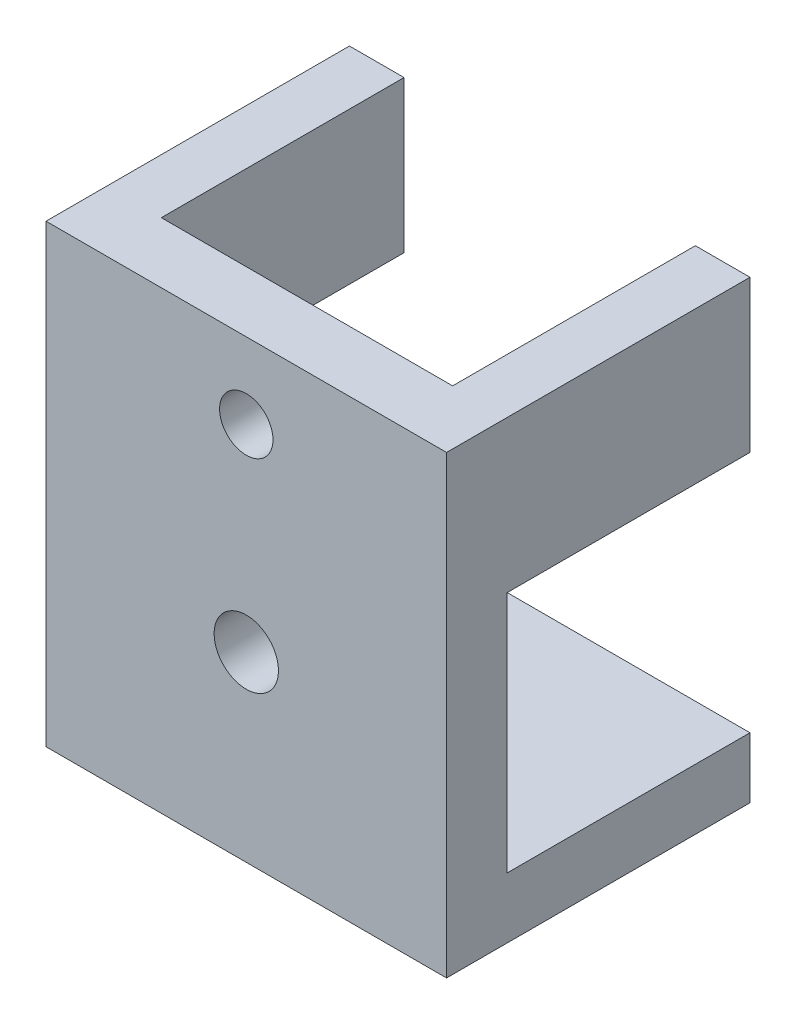
ISO-10303-21;
HEADER;
FILE_DESCRIPTION(('STEP AP214'),'2;1');
FILE_NAME('part.step','',(''),(''),'','','');
FILE_SCHEMA(('AUTOMOTIVE_DESIGN { 1 0 10303 214 1 1 1 1 }'));
ENDSEC;
DATA;
#1=APPLICATION_CONTEXT('core data for automotive mechanical design processes');
#2=APPLICATION_PROTOCOL_DEFINITION('international standard','automotive_design',2000,#1);
#3=PRODUCT_CONTEXT('',#1,'mechanical');
#4=PRODUCT('Part','Part','',(#3));
#5=PRODUCT_RELATED_PRODUCT_CATEGORY('part','',(#4));
#6=PRODUCT_DEFINITION_FORMATION('','',#4);
#7=PRODUCT_DEFINITION_CONTEXT('part definition',#1,'design');
#8=PRODUCT_DEFINITION('design','',#6,#7);
#9=PRODUCT_DEFINITION_SHAPE('','',#8);
#10=(LENGTH_UNIT() NAMED_UNIT(*) SI_UNIT(.MILLI.,.METRE.));
#11=(NAMED_UNIT(*) PLANE_ANGLE_UNIT() SI_UNIT($,.RADIAN.));
#12=(NAMED_UNIT(*) SI_UNIT($,.STERADIAN.) SOLID_ANGLE_UNIT());
#13=UNCERTAINTY_MEASURE_WITH_UNIT(LENGTH_MEASURE(1.E-05),#10,'distance_accuracy_value','');
#14=(GEOMETRIC_REPRESENTATION_CONTEXT(3) GLOBAL_UNCERTAINTY_ASSIGNED_CONTEXT((#13)) GLOBAL_UNIT_ASSIGNED_CONTEXT((#10,
#11,#12)) REPRESENTATION_CONTEXT('',''));
#15=CARTESIAN_POINT('',(0.,0.,0.));
#16=DIRECTION('',(0.,0.,1.));
#17=DIRECTION('',(1.,0.,0.));
#18=AXIS2_PLACEMENT_3D('',#15,#16,#17);
#19=CARTESIAN_POINT('',(0.,0.,0.));
#20=DIRECTION('',(0.,0.,-1.));
#21=DIRECTION('',(-1.,0.,0.));
#22=AXIS2_PLACEMENT_3D('',#19,#20,#21);
#23=PLANE('',#22);
#24=CARTESIAN_POINT('',(16.5,31.25,0.));
#25=DIRECTION('',(0.,0.,-1.));
#26=DIRECTION('',(-1.,0.,0.));
#27=AXIS2_PLACEMENT_3D('',#24,#25,#26);
#28=CIRCLE('',#27,2.2);
#29=CARTESIAN_POINT('',(14.3,31.25,0.));
#30=VERTEX_POINT('',#29);
#31=EDGE_CURVE('E166',#30,#30,#28,.T.);
#32=ORIENTED_EDGE('',*,*,#31,.F.);
#33=EDGE_LOOP('',(#32));
#34=FACE_BOUND('',#33,.T.);
#35=CARTESIAN_POINT('',(16.5,15.,0.));
#36=DIRECTION('',(0.,0.,-1.));
#37=DIRECTION('',(-1.,0.,0.));
#38=AXIS2_PLACEMENT_3D('',#35,#36,#37);
#39=CIRCLE('',#38,2.65);
#40=CARTESIAN_POINT('',(13.85,15.,0.));
#41=VERTEX_POINT('',#40);
#42=EDGE_CURVE('E213',#41,#41,#39,.T.);
#43=ORIENTED_EDGE('',*,*,#42,.F.);
#44=EDGE_LOOP('',(#43));
#45=FACE_BOUND('',#44,.T.);
#46=DIRECTION('',(-1.,0.,0.));
#47=VECTOR('',#46,1.);
#48=CARTESIAN_POINT('',(0.,25.,0.));
#49=LINE('',#48,#47);
#50=CARTESIAN_POINT('',(4.49999999999999,25.,0.));
#51=VERTEX_POINT('',#50);
#52=CARTESIAN_POINT('',(0.,25.,0.));
#53=VERTEX_POINT('',#52);
#54=EDGE_CURVE('E160',#51,#53,#49,.T.);
#55=ORIENTED_EDGE('',*,*,#54,.F.);
#56=DIRECTION('',(0.,-1.,0.));
#57=VECTOR('',#56,1.);
#58=CARTESIAN_POINT('',(4.49999999999999,37.5,0.));
#59=LINE('',#58,#57);
#60=CARTESIAN_POINT('',(4.49999999999999,37.5,0.));
#61=VERTEX_POINT('',#60);
#62=EDGE_CURVE('E163',#61,#51,#59,.T.);
#63=ORIENTED_EDGE('',*,*,#62,.F.);
#64=DIRECTION('',(-1.,0.,0.));
#65=VECTOR('',#64,1.);
#66=CARTESIAN_POINT('',(0.,37.5,0.));
#67=LINE('',#66,#65);
#68=CARTESIAN_POINT('',(28.5,37.5,0.));
#69=VERTEX_POINT('',#68);
#70=EDGE_CURVE('E251',#69,#61,#67,.T.);
#71=ORIENTED_EDGE('',*,*,#70,.F.);
#72=DIRECTION('',(0.,1.,0.));
#73=VECTOR('',#72,1.);
#74=CARTESIAN_POINT('',(28.5,37.5,0.));
#75=LINE('',#74,#73);
#76=CARTESIAN_POINT('',(28.5,25.,0.));
#77=VERTEX_POINT('',#76);
#78=EDGE_CURVE('E190',#77,#69,#75,.T.);
#79=ORIENTED_EDGE('',*,*,#78,.F.);
#80=DIRECTION('',(-1.,0.,0.));
#81=VECTOR('',#80,1.);
#82=CARTESIAN_POINT('',(33.,25.,0.));
#83=LINE('',#82,#81);
#84=CARTESIAN_POINT('',(33.,25.,0.));
#85=VERTEX_POINT('',#84);
#86=EDGE_CURVE('E184',#85,#77,#83,.T.);
#87=ORIENTED_EDGE('',*,*,#86,.F.);
#88=DIRECTION('',(0.,1.,0.));
#89=VECTOR('',#88,1.);
#90=CARTESIAN_POINT('',(33.,0.,0.));
#91=LINE('',#90,#89);
#92=CARTESIAN_POINT('',(33.,5.,0.));
#93=VERTEX_POINT('',#92);
#94=EDGE_CURVE('E261',#93,#85,#91,.T.);
#95=ORIENTED_EDGE('',*,*,#94,.F.);
#96=DIRECTION('',(-1.,0.,0.));
#97=VECTOR('',#96,1.);
#98=CARTESIAN_POINT('',(0.,5.,0.));
#99=LINE('',#98,#97);
#100=CARTESIAN_POINT('',(0.,5.,0.));
#101=VERTEX_POINT('',#100);
#102=EDGE_CURVE('E227',#93,#101,#99,.T.);
#103=ORIENTED_EDGE('',*,*,#102,.T.);
#104=DIRECTION('',(0.,-1.,0.));
#105=VECTOR('',#104,1.);
#106=CARTESIAN_POINT('',(0.,0.,0.));
#107=LINE('',#106,#105);
#108=EDGE_CURVE('E66',#53,#101,#107,.T.);
#109=ORIENTED_EDGE('',*,*,#108,.F.);
#110=EDGE_LOOP('',(#55,#63,#71,#79,#87,#95,#103,#109));
#111=FACE_BOUND('',#110,.T.);
#112=ADVANCED_FACE('F40',(#34,#45,#111),#23,.T.);
#113=CARTESIAN_POINT('',(0.,0.,5.));
#114=DIRECTION('',(1.,0.,0.));
#115=DIRECTION('',(0.,1.,0.));
#116=AXIS2_PLACEMENT_3D('',#113,#114,#115);
#117=PLANE('',#116);
#118=DIRECTION('',(0.,0.,-1.));
#119=VECTOR('',#118,1.);
#120=CARTESIAN_POINT('',(0.,37.5,5.));
#121=LINE('',#120,#119);
#122=CARTESIAN_POINT('',(0.,37.5,5.));
#123=VERTEX_POINT('',#122);
#124=CARTESIAN_POINT('',(0.,37.5,-20.));
#125=VERTEX_POINT('',#124);
#126=EDGE_CURVE('E134',#123,#125,#121,.T.);
#127=ORIENTED_EDGE('',*,*,#126,.T.);
#128=DIRECTION('',(0.,1.,0.));
#129=VECTOR('',#128,1.);
#130=CARTESIAN_POINT('',(0.,37.5,-20.));
#131=LINE('',#130,#129);
#132=CARTESIAN_POINT('',(0.,25.,-20.));
#133=VERTEX_POINT('',#132);
#134=EDGE_CURVE('E137',#133,#125,#131,.T.);
#135=ORIENTED_EDGE('',*,*,#134,.F.);
#136=DIRECTION('',(0.,0.,1.));
#137=VECTOR('',#136,1.);
#138=CARTESIAN_POINT('',(0.,25.,-20.));
#139=LINE('',#138,#137);
#140=EDGE_CURVE('E173',#133,#53,#139,.T.);
#141=ORIENTED_EDGE('',*,*,#140,.T.);
#142=ORIENTED_EDGE('',*,*,#108,.T.);
#143=DIRECTION('',(0.,0.,1.));
#144=VECTOR('',#143,1.);
#145=CARTESIAN_POINT('',(0.,5.,-20.));
#146=LINE('',#145,#144);
#147=CARTESIAN_POINT('',(0.,5.,-20.));
#148=VERTEX_POINT('',#147);
#149=EDGE_CURVE('E243',#148,#101,#146,.T.);
#150=ORIENTED_EDGE('',*,*,#149,.F.);
#151=DIRECTION('',(0.,-1.,0.));
#152=VECTOR('',#151,1.);
#153=CARTESIAN_POINT('',(0.,0.,-20.));
#154=LINE('',#153,#152);
#155=CARTESIAN_POINT('',(0.,0.,-20.));
#156=VERTEX_POINT('',#155);
#157=EDGE_CURVE('E222',#148,#156,#154,.T.);
#158=ORIENTED_EDGE('',*,*,#157,.T.);
#159=DIRECTION('',(0.,0.,-1.));
#160=VECTOR('',#159,1.);
#161=CARTESIAN_POINT('',(0.,0.,5.));
#162=LINE('',#161,#160);
#163=CARTESIAN_POINT('',(0.,0.,5.));
#164=VERTEX_POINT('',#163);
#165=EDGE_CURVE('E12',#164,#156,#162,.T.);
#166=ORIENTED_EDGE('',*,*,#165,.F.);
#167=DIRECTION('',(0.,-1.,0.));
#168=VECTOR('',#167,1.);
#169=CARTESIAN_POINT('',(0.,0.,5.));
#170=LINE('',#169,#168);
#171=EDGE_CURVE('E140',#123,#164,#170,.T.);
#172=ORIENTED_EDGE('',*,*,#171,.F.);
#173=EDGE_LOOP('',(#127,#135,#141,#142,#150,#158,#166,#172));
#174=FACE_BOUND('',#173,.T.);
#175=ADVANCED_FACE('F42',(#174),#117,.F.);
#176=CARTESIAN_POINT('',(0.,0.,5.));
#177=DIRECTION('',(0.,1.,0.));
#178=DIRECTION('',(0.,0.,1.));
#179=AXIS2_PLACEMENT_3D('',#176,#177,#178);
#180=PLANE('',#179);
#181=CARTESIAN_POINT('',(16.5,0.,-10.));
#182=DIRECTION('',(0.,-1.,0.));
#183=DIRECTION('',(0.,0.,-1.));
#184=AXIS2_PLACEMENT_3D('',#181,#182,#183);
#185=CIRCLE('',#184,2.65);
#186=CARTESIAN_POINT('',(16.5,0.,-12.65));
#187=VERTEX_POINT('',#186);
#188=EDGE_CURVE('E217',#187,#187,#185,.T.);
#189=ORIENTED_EDGE('',*,*,#188,.F.);
#190=EDGE_LOOP('',(#189));
#191=FACE_BOUND('',#190,.T.);
#192=ORIENTED_EDGE('',*,*,#165,.T.);
#193=DIRECTION('',(1.,0.,0.));
#194=VECTOR('',#193,1.);
#195=CARTESIAN_POINT('',(0.,0.,-20.));
#196=LINE('',#195,#194);
#197=CARTESIAN_POINT('',(33.,0.,-20.));
#198=VERTEX_POINT('',#197);
#199=EDGE_CURVE('E226',#156,#198,#196,.T.);
#200=ORIENTED_EDGE('',*,*,#199,.T.);
#201=DIRECTION('',(0.,0.,-1.));
#202=VECTOR('',#201,1.);
#203=CARTESIAN_POINT('',(33.,0.,5.));
#204=LINE('',#203,#202);
#205=CARTESIAN_POINT('',(33.,0.,5.));
#206=VERTEX_POINT('',#205);
#207=EDGE_CURVE('E50',#206,#198,#204,.T.);
#208=ORIENTED_EDGE('',*,*,#207,.F.);
#209=DIRECTION('',(1.,0.,0.));
#210=VECTOR('',#209,1.);
#211=CARTESIAN_POINT('',(0.,0.,5.));
#212=LINE('',#211,#210);
#213=EDGE_CURVE('E250',#164,#206,#212,.T.);
#214=ORIENTED_EDGE('',*,*,#213,.F.);
#215=EDGE_LOOP('',(#192,#200,#208,#214));
#216=FACE_BOUND('',#215,.T.);
#217=ADVANCED_FACE('F301',(#191,#216),#180,.F.);
#218=CARTESIAN_POINT('',(33.,0.,5.));
#219=DIRECTION('',(-1.,0.,0.));
#220=DIRECTION('',(0.,-1.,0.));
#221=AXIS2_PLACEMENT_3D('',#218,#219,#220);
#222=PLANE('',#221);
#223=ORIENTED_EDGE('',*,*,#207,.T.);
#224=DIRECTION('',(0.,1.,0.));
#225=VECTOR('',#224,1.);
#226=CARTESIAN_POINT('',(33.,0.,-20.));
#227=LINE('',#226,#225);
#228=CARTESIAN_POINT('',(33.,5.,-20.));
#229=VERTEX_POINT('',#228);
#230=EDGE_CURVE('E231',#198,#229,#227,.T.);
#231=ORIENTED_EDGE('',*,*,#230,.T.);
#232=DIRECTION('',(0.,0.,1.));
#233=VECTOR('',#232,1.);
#234=CARTESIAN_POINT('',(33.,5.,-20.));
#235=LINE('',#234,#233);
#236=EDGE_CURVE('E239',#229,#93,#235,.T.);
#237=ORIENTED_EDGE('',*,*,#236,.T.);
#238=ORIENTED_EDGE('',*,*,#94,.T.);
#239=DIRECTION('',(0.,0.,1.));
#240=VECTOR('',#239,1.);
#241=CARTESIAN_POINT('',(33.,25.,-20.));
#242=LINE('',#241,#240);
#243=CARTESIAN_POINT('',(33.,25.,-20.));
#244=VERTEX_POINT('',#243);
#245=EDGE_CURVE('E210',#244,#85,#242,.T.);
#246=ORIENTED_EDGE('',*,*,#245,.F.);
#247=DIRECTION('',(0.,-1.,0.));
#248=VECTOR('',#247,1.);
#249=CARTESIAN_POINT('',(33.,37.5,-20.));
#250=LINE('',#249,#248);
#251=CARTESIAN_POINT('',(33.,37.5,-20.));
#252=VERTEX_POINT('',#251);
#253=EDGE_CURVE('E185',#252,#244,#250,.T.);
#254=ORIENTED_EDGE('',*,*,#253,.F.);
#255=DIRECTION('',(0.,0.,-1.));
#256=VECTOR('',#255,1.);
#257=CARTESIAN_POINT('',(33.,37.5,5.));
#258=LINE('',#257,#256);
#259=CARTESIAN_POINT('',(33.,37.5,5.));
#260=VERTEX_POINT('',#259);
#261=EDGE_CURVE('E143',#260,#252,#258,.T.);
#262=ORIENTED_EDGE('',*,*,#261,.F.);
#263=DIRECTION('',(0.,1.,0.));
#264=VECTOR('',#263,1.);
#265=CARTESIAN_POINT('',(33.,0.,5.));
#266=LINE('',#265,#264);
#267=EDGE_CURVE('E254',#206,#260,#266,.T.);
#268=ORIENTED_EDGE('',*,*,#267,.F.);
#269=EDGE_LOOP('',(#223,#231,#237,#238,#246,#254,#262,#268));
#270=FACE_BOUND('',#269,.T.);
#271=ADVANCED_FACE('F291',(#270),#222,.F.);
#272=CARTESIAN_POINT('',(0.,37.5,5.));
#273=DIRECTION('',(0.,-1.,0.));
#274=DIRECTION('',(0.,0.,-1.));
#275=AXIS2_PLACEMENT_3D('',#272,#273,#274);
#276=PLANE('',#275);
#277=ORIENTED_EDGE('',*,*,#261,.T.);
#278=DIRECTION('',(1.,0.,0.));
#279=VECTOR('',#278,1.);
#280=CARTESIAN_POINT('',(33.,37.5,-20.));
#281=LINE('',#280,#279);
#282=CARTESIAN_POINT('',(28.5,37.5,-20.));
#283=VERTEX_POINT('',#282);
#284=EDGE_CURVE('E196',#283,#252,#281,.T.);
#285=ORIENTED_EDGE('',*,*,#284,.F.);
#286=DIRECTION('',(0.,0.,1.));
#287=VECTOR('',#286,1.);
#288=CARTESIAN_POINT('',(28.5,37.5,-20.));
#289=LINE('',#288,#287);
#290=EDGE_CURVE('E58',#283,#69,#289,.T.);
#291=ORIENTED_EDGE('',*,*,#290,.T.);
#292=ORIENTED_EDGE('',*,*,#70,.T.);
#293=DIRECTION('',(0.,0.,1.));
#294=VECTOR('',#293,1.);
#295=CARTESIAN_POINT('',(4.49999999999999,37.5,-20.));
#296=LINE('',#295,#294);
#297=CARTESIAN_POINT('',(4.49999999999999,37.5,-20.));
#298=VERTEX_POINT('',#297);
#299=EDGE_CURVE('E149',#298,#61,#296,.T.);
#300=ORIENTED_EDGE('',*,*,#299,.F.);
#301=DIRECTION('',(1.,0.,0.));
#302=VECTOR('',#301,1.);
#303=CARTESIAN_POINT('',(0.,37.5,-20.));
#304=LINE('',#303,#302);
#305=EDGE_CURVE('E147',#125,#298,#304,.T.);
#306=ORIENTED_EDGE('',*,*,#305,.F.);
#307=ORIENTED_EDGE('',*,*,#126,.F.);
#308=DIRECTION('',(-1.,0.,0.));
#309=VECTOR('',#308,1.);
#310=CARTESIAN_POINT('',(0.,37.5,5.));
#311=LINE('',#310,#309);
#312=EDGE_CURVE('E144',#260,#123,#311,.T.);
#313=ORIENTED_EDGE('',*,*,#312,.F.);
#314=EDGE_LOOP('',(#277,#285,#291,#292,#300,#306,#307,#313));
#315=FACE_BOUND('',#314,.T.);
#316=ADVANCED_FACE('F148',(#315),#276,.F.);
#317=CARTESIAN_POINT('',(0.,0.,5.));
#318=DIRECTION('',(0.,0.,-1.));
#319=DIRECTION('',(-1.,0.,0.));
#320=AXIS2_PLACEMENT_3D('',#317,#318,#319);
#321=PLANE('',#320);
#322=CARTESIAN_POINT('',(16.5,31.25,5.));
#323=DIRECTION('',(0.,0.,1.));
#324=DIRECTION('',(1.,0.,0.));
#325=AXIS2_PLACEMENT_3D('',#322,#323,#324);
#326=CIRCLE('',#325,2.2);
#327=CARTESIAN_POINT('',(18.7,31.25,5.));
#328=VERTEX_POINT('',#327);
#329=EDGE_CURVE('E413',#328,#328,#326,.T.);
#330=ORIENTED_EDGE('',*,*,#329,.F.);
#331=EDGE_LOOP('',(#330));
#332=FACE_BOUND('',#331,.T.);
#333=CARTESIAN_POINT('',(16.5,15.,5.));
#334=DIRECTION('',(0.,0.,-1.));
#335=DIRECTION('',(-1.,0.,0.));
#336=AXIS2_PLACEMENT_3D('',#333,#334,#335);
#337=CIRCLE('',#336,2.65);
#338=CARTESIAN_POINT('',(13.85,15.,5.));
#339=VERTEX_POINT('',#338);
#340=EDGE_CURVE('E44',#339,#339,#337,.T.);
#341=ORIENTED_EDGE('',*,*,#340,.T.);
#342=EDGE_LOOP('',(#341));
#343=FACE_BOUND('',#342,.T.);
#344=ORIENTED_EDGE('',*,*,#171,.T.);
#345=ORIENTED_EDGE('',*,*,#213,.T.);
#346=ORIENTED_EDGE('',*,*,#267,.T.);
#347=ORIENTED_EDGE('',*,*,#312,.T.);
#348=EDGE_LOOP('',(#344,#345,#346,#347));
#349=FACE_BOUND('',#348,.T.);
#350=ADVANCED_FACE('F281',(#332,#343,#349),#321,.F.);
#351=CARTESIAN_POINT('',(0.,5.,-20.));
#352=DIRECTION('',(0.,1.,0.));
#353=DIRECTION('',(0.,0.,1.));
#354=AXIS2_PLACEMENT_3D('',#351,#352,#353);
#355=PLANE('',#354);
#356=CARTESIAN_POINT('',(16.5,5.,-10.));
#357=DIRECTION('',(0.,1.,0.));
#358=DIRECTION('',(0.,0.,1.));
#359=AXIS2_PLACEMENT_3D('',#356,#357,#358);
#360=CIRCLE('',#359,2.65);
#361=CARTESIAN_POINT('',(16.5,5.,-7.34999999999999));
#362=VERTEX_POINT('',#361);
#363=EDGE_CURVE('E221',#362,#362,#360,.T.);
#364=ORIENTED_EDGE('',*,*,#363,.F.);
#365=EDGE_LOOP('',(#364));
#366=FACE_BOUND('',#365,.T.);
#367=ORIENTED_EDGE('',*,*,#102,.F.);
#368=ORIENTED_EDGE('',*,*,#236,.F.);
#369=DIRECTION('',(-1.,0.,0.));
#370=VECTOR('',#369,1.);
#371=CARTESIAN_POINT('',(0.,5.,-20.));
#372=LINE('',#371,#370);
#373=EDGE_CURVE('E235',#229,#148,#372,.T.);
#374=ORIENTED_EDGE('',*,*,#373,.T.);
#375=ORIENTED_EDGE('',*,*,#149,.T.);
#376=EDGE_LOOP('',(#367,#368,#374,#375));
#377=FACE_BOUND('',#376,.T.);
#378=ADVANCED_FACE('F277',(#366,#377),#355,.T.);
#379=CARTESIAN_POINT('',(0.,0.,-20.));
#380=DIRECTION('',(0.,0.,-1.));
#381=DIRECTION('',(-1.,0.,0.));
#382=AXIS2_PLACEMENT_3D('',#379,#380,#381);
#383=PLANE('',#382);
#384=ORIENTED_EDGE('',*,*,#157,.F.);
#385=ORIENTED_EDGE('',*,*,#373,.F.);
#386=ORIENTED_EDGE('',*,*,#230,.F.);
#387=ORIENTED_EDGE('',*,*,#199,.F.);
#388=EDGE_LOOP('',(#384,#385,#386,#387));
#389=FACE_BOUND('',#388,.T.);
#390=ADVANCED_FACE('F280',(#389),#383,.T.);
#391=CARTESIAN_POINT('',(16.5,10.,-10.));
#392=DIRECTION('',(0.,-1.,0.));
#393=DIRECTION('',(0.,0.,-1.));
#394=AXIS2_PLACEMENT_3D('',#391,#392,#393);
#395=CYLINDRICAL_SURFACE('',#394,2.65);
#396=ORIENTED_EDGE('',*,*,#363,.T.);
#397=EDGE_LOOP('',(#396));
#398=FACE_BOUND('',#397,.T.);
#399=ORIENTED_EDGE('',*,*,#188,.T.);
#400=EDGE_LOOP('',(#399));
#401=FACE_BOUND('',#400,.T.);
#402=ADVANCED_FACE('F274',(#398,#401),#395,.F.);
#403=CARTESIAN_POINT('',(16.5,15.,10.));
#404=DIRECTION('',(0.,0.,-1.));
#405=DIRECTION('',(-1.,0.,0.));
#406=AXIS2_PLACEMENT_3D('',#403,#404,#405);
#407=CYLINDRICAL_SURFACE('',#406,2.65);
#408=ORIENTED_EDGE('',*,*,#42,.T.);
#409=EDGE_LOOP('',(#408));
#410=FACE_BOUND('',#409,.T.);
#411=ORIENTED_EDGE('',*,*,#340,.F.);
#412=EDGE_LOOP('',(#411));
#413=FACE_BOUND('',#412,.T.);
#414=ADVANCED_FACE('F345',(#410,#413),#407,.F.);
#415=CARTESIAN_POINT('',(33.,25.,-20.));
#416=DIRECTION('',(0.,1.,0.));
#417=DIRECTION('',(0.,0.,1.));
#418=AXIS2_PLACEMENT_3D('',#415,#416,#417);
#419=PLANE('',#418);
#420=ORIENTED_EDGE('',*,*,#86,.T.);
#421=DIRECTION('',(0.,0.,1.));
#422=VECTOR('',#421,1.);
#423=CARTESIAN_POINT('',(28.5,25.,-20.));
#424=LINE('',#423,#422);
#425=CARTESIAN_POINT('',(28.5,25.,-20.));
#426=VERTEX_POINT('',#425);
#427=EDGE_CURVE('E206',#426,#77,#424,.T.);
#428=ORIENTED_EDGE('',*,*,#427,.F.);
#429=DIRECTION('',(-1.,0.,0.));
#430=VECTOR('',#429,1.);
#431=CARTESIAN_POINT('',(33.,25.,-20.));
#432=LINE('',#431,#430);
#433=EDGE_CURVE('E189',#244,#426,#432,.T.);
#434=ORIENTED_EDGE('',*,*,#433,.F.);
#435=ORIENTED_EDGE('',*,*,#245,.T.);
#436=EDGE_LOOP('',(#420,#428,#434,#435));
#437=FACE_BOUND('',#436,.T.);
#438=ADVANCED_FACE('F351',(#437),#419,.F.);
#439=CARTESIAN_POINT('',(28.5,37.5,-20.));
#440=DIRECTION('',(1.,0.,0.));
#441=DIRECTION('',(0.,0.,-1.));
#442=AXIS2_PLACEMENT_3D('',#439,#440,#441);
#443=PLANE('',#442);
#444=ORIENTED_EDGE('',*,*,#78,.T.);
#445=ORIENTED_EDGE('',*,*,#290,.F.);
#446=DIRECTION('',(0.,1.,0.));
#447=VECTOR('',#446,1.);
#448=CARTESIAN_POINT('',(28.5,37.5,-20.));
#449=LINE('',#448,#447);
#450=EDGE_CURVE('E193',#426,#283,#449,.T.);
#451=ORIENTED_EDGE('',*,*,#450,.F.);
#452=ORIENTED_EDGE('',*,*,#427,.T.);
#453=EDGE_LOOP('',(#444,#445,#451,#452));
#454=FACE_BOUND('',#453,.T.);
#455=ADVANCED_FACE('F309',(#454),#443,.F.);
#456=CARTESIAN_POINT('',(0.,0.,-20.));
#457=DIRECTION('',(0.,0.,-1.));
#458=DIRECTION('',(-1.,0.,0.));
#459=AXIS2_PLACEMENT_3D('',#456,#457,#458);
#460=PLANE('',#459);
#461=ORIENTED_EDGE('',*,*,#253,.T.);
#462=ORIENTED_EDGE('',*,*,#433,.T.);
#463=ORIENTED_EDGE('',*,*,#450,.T.);
#464=ORIENTED_EDGE('',*,*,#284,.T.);
#465=EDGE_LOOP('',(#461,#462,#463,#464));
#466=FACE_BOUND('',#465,.T.);
#467=ADVANCED_FACE('F305',(#466),#460,.T.);
#468=CARTESIAN_POINT('',(4.49999999999999,37.5,-20.));
#469=DIRECTION('',(-1.,0.,0.));
#470=DIRECTION('',(0.,-1.,0.));
#471=AXIS2_PLACEMENT_3D('',#468,#469,#470);
#472=PLANE('',#471);
#473=ORIENTED_EDGE('',*,*,#62,.T.);
#474=DIRECTION('',(0.,0.,1.));
#475=VECTOR('',#474,1.);
#476=CARTESIAN_POINT('',(4.49999999999999,25.,-20.));
#477=LINE('',#476,#475);
#478=CARTESIAN_POINT('',(4.49999999999999,25.,-20.));
#479=VERTEX_POINT('',#478);
#480=EDGE_CURVE('E178',#479,#51,#477,.T.);
#481=ORIENTED_EDGE('',*,*,#480,.F.);
#482=DIRECTION('',(0.,-1.,0.));
#483=VECTOR('',#482,1.);
#484=CARTESIAN_POINT('',(4.49999999999999,37.5,-20.));
#485=LINE('',#484,#483);
#486=EDGE_CURVE('E153',#298,#479,#485,.T.);
#487=ORIENTED_EDGE('',*,*,#486,.F.);
#488=ORIENTED_EDGE('',*,*,#299,.T.);
#489=EDGE_LOOP('',(#473,#481,#487,#488));
#490=FACE_BOUND('',#489,.T.);
#491=ADVANCED_FACE('F314',(#490),#472,.F.);
#492=CARTESIAN_POINT('',(0.,25.,-20.));
#493=DIRECTION('',(0.,1.,0.));
#494=DIRECTION('',(0.,0.,1.));
#495=AXIS2_PLACEMENT_3D('',#492,#493,#494);
#496=PLANE('',#495);
#497=ORIENTED_EDGE('',*,*,#54,.T.);
#498=ORIENTED_EDGE('',*,*,#140,.F.);
#499=DIRECTION('',(-1.,0.,0.));
#500=VECTOR('',#499,1.);
#501=CARTESIAN_POINT('',(0.,25.,-20.));
#502=LINE('',#501,#500);
#503=EDGE_CURVE('E157',#479,#133,#502,.T.);
#504=ORIENTED_EDGE('',*,*,#503,.F.);
#505=ORIENTED_EDGE('',*,*,#480,.T.);
#506=EDGE_LOOP('',(#497,#498,#504,#505));
#507=FACE_BOUND('',#506,.T.);
#508=ADVANCED_FACE('F316',(#507),#496,.F.);
#509=CARTESIAN_POINT('',(0.,0.,-20.));
#510=DIRECTION('',(0.,0.,1.));
#511=DIRECTION('',(1.,0.,0.));
#512=AXIS2_PLACEMENT_3D('',#509,#510,#511);
#513=PLANE('',#512);
#514=ORIENTED_EDGE('',*,*,#134,.T.);
#515=ORIENTED_EDGE('',*,*,#305,.T.);
#516=ORIENTED_EDGE('',*,*,#486,.T.);
#517=ORIENTED_EDGE('',*,*,#503,.T.);
#518=EDGE_LOOP('',(#514,#515,#516,#517));
#519=FACE_BOUND('',#518,.T.);
#520=ADVANCED_FACE('F155',(#519),#513,.F.);
#521=CARTESIAN_POINT('',(16.5,31.25,-5.));
#522=DIRECTION('',(0.,0.,1.));
#523=DIRECTION('',(1.,0.,0.));
#524=AXIS2_PLACEMENT_3D('',#521,#522,#523);
#525=CYLINDRICAL_SURFACE('',#524,2.2);
#526=ORIENTED_EDGE('',*,*,#31,.T.);
#527=EDGE_LOOP('',(#526));
#528=FACE_BOUND('',#527,.T.);
#529=ORIENTED_EDGE('',*,*,#329,.T.);
#530=EDGE_LOOP('',(#529));
#531=FACE_BOUND('',#530,.T.);
#532=ADVANCED_FACE('F323',(#528,#531),#525,.F.);
#533=CLOSED_SHELL('',(#112,#175,#217,#271,#316,#350,#378,#390,#402,#414,#438,#455,#467,#491,
#508,#520,#532));
#534=MANIFOLD_SOLID_BREP('B2',#533);
#535=ADVANCED_BREP_SHAPE_REPRESENTATION('',(#18,#534),#14);
#536=SHAPE_DEFINITION_REPRESENTATION(#9,#535);
ENDSEC;
END-ISO-10303-21;
